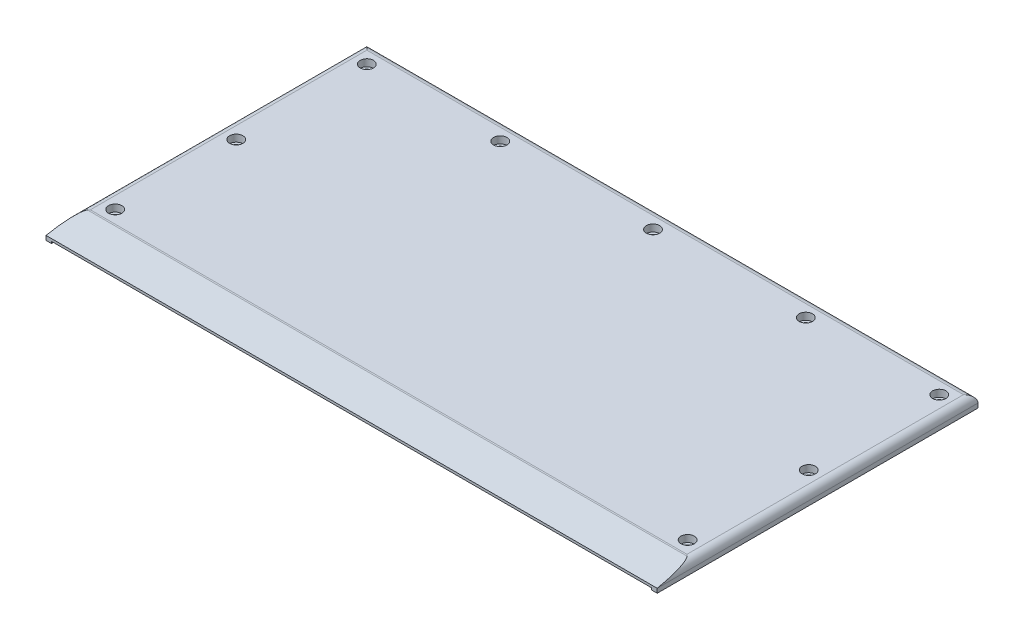
ISO-10303-21;
HEADER;
FILE_DESCRIPTION(('STEP AP214'),'2;1');
FILE_NAME('part.step','',(''),(''),'','','');
FILE_SCHEMA(('AUTOMOTIVE_DESIGN { 1 0 10303 214 1 1 1 1 }'));
ENDSEC;
DATA;
#1=APPLICATION_CONTEXT('core data for automotive mechanical design processes');
#2=APPLICATION_PROTOCOL_DEFINITION('international standard','automotive_design',2000,#1);
#3=PRODUCT_CONTEXT('',#1,'mechanical');
#4=PRODUCT('Part','Part','',(#3));
#5=PRODUCT_RELATED_PRODUCT_CATEGORY('part','',(#4));
#6=PRODUCT_DEFINITION_FORMATION('','',#4);
#7=PRODUCT_DEFINITION_CONTEXT('part definition',#1,'design');
#8=PRODUCT_DEFINITION('design','',#6,#7);
#9=PRODUCT_DEFINITION_SHAPE('','',#8);
#10=(LENGTH_UNIT() NAMED_UNIT(*) SI_UNIT(.MILLI.,.METRE.));
#11=(NAMED_UNIT(*) PLANE_ANGLE_UNIT() SI_UNIT($,.RADIAN.));
#12=(NAMED_UNIT(*) SI_UNIT($,.STERADIAN.) SOLID_ANGLE_UNIT());
#13=UNCERTAINTY_MEASURE_WITH_UNIT(LENGTH_MEASURE(1.E-05),#10,'distance_accuracy_value','');
#14=(GEOMETRIC_REPRESENTATION_CONTEXT(3) GLOBAL_UNCERTAINTY_ASSIGNED_CONTEXT((#13)) GLOBAL_UNIT_ASSIGNED_CONTEXT((#10,
#11,#12)) REPRESENTATION_CONTEXT('',''));
#15=CARTESIAN_POINT('',(0.,0.,0.));
#16=DIRECTION('',(0.,0.,1.));
#17=DIRECTION('',(1.,0.,0.));
#18=AXIS2_PLACEMENT_3D('',#15,#16,#17);
#19=CARTESIAN_POINT('',(8.,4.,61.92));
#20=DIRECTION('',(0.,-1.,0.));
#21=DIRECTION('',(0.,0.,-1.));
#22=AXIS2_PLACEMENT_3D('',#19,#20,#21);
#23=CYLINDRICAL_SURFACE('',#22,1.6);
#24=CARTESIAN_POINT('',(8.,0.,61.92));
#25=DIRECTION('',(0.,1.,0.));
#26=DIRECTION('',(0.,0.,1.));
#27=AXIS2_PLACEMENT_3D('',#24,#25,#26);
#28=CIRCLE('',#27,1.6);
#29=CARTESIAN_POINT('',(8.,0.,63.52));
#30=VERTEX_POINT('',#29);
#31=EDGE_CURVE('E387',#30,#30,#28,.T.);
#32=ORIENTED_EDGE('',*,*,#31,.F.);
#33=EDGE_LOOP('',(#32));
#34=FACE_BOUND('',#33,.T.);
#35=CARTESIAN_POINT('',(8.,1.1,61.92));
#36=DIRECTION('',(0.,1.,0.));
#37=DIRECTION('',(0.,0.,1.));
#38=AXIS2_PLACEMENT_3D('',#35,#36,#37);
#39=CIRCLE('',#38,1.6);
#40=CARTESIAN_POINT('',(8.,1.1,63.52));
#41=VERTEX_POINT('',#40);
#42=EDGE_CURVE('E239',#41,#41,#39,.T.);
#43=ORIENTED_EDGE('',*,*,#42,.T.);
#44=EDGE_LOOP('',(#43));
#45=FACE_BOUND('',#44,.T.);
#46=ADVANCED_FACE('F43',(#34,#45),#23,.F.);
#47=CARTESIAN_POINT('',(8.,4.,8.));
#48=DIRECTION('',(0.,-1.,0.));
#49=DIRECTION('',(0.,0.,-1.));
#50=AXIS2_PLACEMENT_3D('',#47,#48,#49);
#51=CYLINDRICAL_SURFACE('',#50,1.6);
#52=CARTESIAN_POINT('',(8.,0.,8.));
#53=DIRECTION('',(0.,1.,0.));
#54=DIRECTION('',(0.,0.,1.));
#55=AXIS2_PLACEMENT_3D('',#52,#53,#54);
#56=CIRCLE('',#55,1.6);
#57=CARTESIAN_POINT('',(8.,0.,9.6));
#58=VERTEX_POINT('',#57);
#59=EDGE_CURVE('E383',#58,#58,#56,.T.);
#60=ORIENTED_EDGE('',*,*,#59,.F.);
#61=EDGE_LOOP('',(#60));
#62=FACE_BOUND('',#61,.T.);
#63=CARTESIAN_POINT('',(8.,1.1,8.));
#64=DIRECTION('',(0.,1.,0.));
#65=DIRECTION('',(0.,0.,1.));
#66=AXIS2_PLACEMENT_3D('',#63,#64,#65);
#67=CIRCLE('',#66,1.6);
#68=CARTESIAN_POINT('',(8.,1.1,9.6));
#69=VERTEX_POINT('',#68);
#70=EDGE_CURVE('E235',#69,#69,#67,.T.);
#71=ORIENTED_EDGE('',*,*,#70,.T.);
#72=EDGE_LOOP('',(#71));
#73=FACE_BOUND('',#72,.T.);
#74=ADVANCED_FACE('F442',(#62,#73),#51,.F.);
#75=CARTESIAN_POINT('',(244.42,4.,8.));
#76=DIRECTION('',(0.,-1.,0.));
#77=DIRECTION('',(0.,0.,-1.));
#78=AXIS2_PLACEMENT_3D('',#75,#76,#77);
#79=CYLINDRICAL_SURFACE('',#78,1.59999999999999);
#80=CARTESIAN_POINT('',(244.42,0.,8.));
#81=DIRECTION('',(0.,1.,0.));
#82=DIRECTION('',(0.,0.,1.));
#83=AXIS2_PLACEMENT_3D('',#80,#81,#82);
#84=CIRCLE('',#83,1.59999999999999);
#85=CARTESIAN_POINT('',(244.42,0.,9.59999999999999));
#86=VERTEX_POINT('',#85);
#87=EDGE_CURVE('E379',#86,#86,#84,.T.);
#88=ORIENTED_EDGE('',*,*,#87,.F.);
#89=EDGE_LOOP('',(#88));
#90=FACE_BOUND('',#89,.T.);
#91=CARTESIAN_POINT('',(244.42,1.1,8.));
#92=DIRECTION('',(0.,1.,0.));
#93=DIRECTION('',(0.,0.,1.));
#94=AXIS2_PLACEMENT_3D('',#91,#92,#93);
#95=CIRCLE('',#94,1.59999999999999);
#96=CARTESIAN_POINT('',(244.42,1.1,9.59999999999999));
#97=VERTEX_POINT('',#96);
#98=EDGE_CURVE('E231',#97,#97,#95,.T.);
#99=ORIENTED_EDGE('',*,*,#98,.T.);
#100=EDGE_LOOP('',(#99));
#101=FACE_BOUND('',#100,.T.);
#102=ADVANCED_FACE('F448',(#90,#101),#79,.F.);
#103=CARTESIAN_POINT('',(244.42,4.,61.92));
#104=DIRECTION('',(0.,-1.,0.));
#105=DIRECTION('',(0.,0.,-1.));
#106=AXIS2_PLACEMENT_3D('',#103,#104,#105);
#107=CYLINDRICAL_SURFACE('',#106,1.59999999999999);
#108=CARTESIAN_POINT('',(244.42,0.,61.92));
#109=DIRECTION('',(0.,1.,0.));
#110=DIRECTION('',(0.,0.,1.));
#111=AXIS2_PLACEMENT_3D('',#108,#109,#110);
#112=CIRCLE('',#111,1.59999999999999);
#113=CARTESIAN_POINT('',(244.42,0.,63.52));
#114=VERTEX_POINT('',#113);
#115=EDGE_CURVE('E375',#114,#114,#112,.T.);
#116=ORIENTED_EDGE('',*,*,#115,.F.);
#117=EDGE_LOOP('',(#116));
#118=FACE_BOUND('',#117,.T.);
#119=CARTESIAN_POINT('',(244.42,1.1,61.92));
#120=DIRECTION('',(0.,1.,0.));
#121=DIRECTION('',(0.,0.,1.));
#122=AXIS2_PLACEMENT_3D('',#119,#120,#121);
#123=CIRCLE('',#122,1.59999999999999);
#124=CARTESIAN_POINT('',(244.42,1.1,63.52));
#125=VERTEX_POINT('',#124);
#126=EDGE_CURVE('E227',#125,#125,#123,.T.);
#127=ORIENTED_EDGE('',*,*,#126,.T.);
#128=EDGE_LOOP('',(#127));
#129=FACE_BOUND('',#128,.T.);
#130=ADVANCED_FACE('F457',(#118,#129),#107,.F.);
#131=CARTESIAN_POINT('',(244.42,4.,111.92));
#132=DIRECTION('',(0.,-1.,0.));
#133=DIRECTION('',(0.,0.,-1.));
#134=AXIS2_PLACEMENT_3D('',#131,#132,#133);
#135=CYLINDRICAL_SURFACE('',#134,1.59999999999999);
#136=CARTESIAN_POINT('',(244.42,0.,111.92));
#137=DIRECTION('',(0.,1.,0.));
#138=DIRECTION('',(0.,0.,1.));
#139=AXIS2_PLACEMENT_3D('',#136,#137,#138);
#140=CIRCLE('',#139,1.59999999999999);
#141=CARTESIAN_POINT('',(244.42,0.,113.52));
#142=VERTEX_POINT('',#141);
#143=EDGE_CURVE('E371',#142,#142,#140,.T.);
#144=ORIENTED_EDGE('',*,*,#143,.F.);
#145=EDGE_LOOP('',(#144));
#146=FACE_BOUND('',#145,.T.);
#147=CARTESIAN_POINT('',(244.42,1.1,111.92));
#148=DIRECTION('',(0.,1.,0.));
#149=DIRECTION('',(0.,0.,1.));
#150=AXIS2_PLACEMENT_3D('',#147,#148,#149);
#151=CIRCLE('',#150,1.59999999999999);
#152=CARTESIAN_POINT('',(244.42,1.1,113.52));
#153=VERTEX_POINT('',#152);
#154=EDGE_CURVE('E223',#153,#153,#151,.T.);
#155=ORIENTED_EDGE('',*,*,#154,.T.);
#156=EDGE_LOOP('',(#155));
#157=FACE_BOUND('',#156,.T.);
#158=ADVANCED_FACE('F461',(#146,#157),#135,.F.);
#159=CARTESIAN_POINT('',(63.11,4.,8.));
#160=DIRECTION('',(0.,-1.,0.));
#161=DIRECTION('',(0.,0.,-1.));
#162=AXIS2_PLACEMENT_3D('',#159,#160,#161);
#163=CYLINDRICAL_SURFACE('',#162,1.60000000000001);
#164=CARTESIAN_POINT('',(63.11,0.,8.));
#165=DIRECTION('',(0.,1.,0.));
#166=DIRECTION('',(0.,0.,1.));
#167=AXIS2_PLACEMENT_3D('',#164,#165,#166);
#168=CIRCLE('',#167,1.60000000000001);
#169=CARTESIAN_POINT('',(63.11,0.,9.60000000000001));
#170=VERTEX_POINT('',#169);
#171=EDGE_CURVE('E367',#170,#170,#168,.T.);
#172=ORIENTED_EDGE('',*,*,#171,.F.);
#173=EDGE_LOOP('',(#172));
#174=FACE_BOUND('',#173,.T.);
#175=CARTESIAN_POINT('',(63.11,1.1,8.));
#176=DIRECTION('',(0.,1.,0.));
#177=DIRECTION('',(0.,0.,1.));
#178=AXIS2_PLACEMENT_3D('',#175,#176,#177);
#179=CIRCLE('',#178,1.60000000000001);
#180=CARTESIAN_POINT('',(63.11,1.1,9.60000000000001));
#181=VERTEX_POINT('',#180);
#182=EDGE_CURVE('E219',#181,#181,#179,.T.);
#183=ORIENTED_EDGE('',*,*,#182,.T.);
#184=EDGE_LOOP('',(#183));
#185=FACE_BOUND('',#184,.T.);
#186=ADVANCED_FACE('F465',(#174,#185),#163,.F.);
#187=CARTESIAN_POINT('',(126.21,4.,8.));
#188=DIRECTION('',(0.,-1.,0.));
#189=DIRECTION('',(0.,0.,-1.));
#190=AXIS2_PLACEMENT_3D('',#187,#188,#189);
#191=CYLINDRICAL_SURFACE('',#190,1.59999999999999);
#192=CARTESIAN_POINT('',(126.21,0.,8.));
#193=DIRECTION('',(0.,1.,0.));
#194=DIRECTION('',(0.,0.,1.));
#195=AXIS2_PLACEMENT_3D('',#192,#193,#194);
#196=CIRCLE('',#195,1.59999999999999);
#197=CARTESIAN_POINT('',(126.21,0.,9.59999999999999));
#198=VERTEX_POINT('',#197);
#199=EDGE_CURVE('E363',#198,#198,#196,.T.);
#200=ORIENTED_EDGE('',*,*,#199,.F.);
#201=EDGE_LOOP('',(#200));
#202=FACE_BOUND('',#201,.T.);
#203=CARTESIAN_POINT('',(126.21,1.1,8.));
#204=DIRECTION('',(0.,1.,0.));
#205=DIRECTION('',(0.,0.,1.));
#206=AXIS2_PLACEMENT_3D('',#203,#204,#205);
#207=CIRCLE('',#206,1.59999999999999);
#208=CARTESIAN_POINT('',(126.21,1.1,9.59999999999999));
#209=VERTEX_POINT('',#208);
#210=EDGE_CURVE('E215',#209,#209,#207,.T.);
#211=ORIENTED_EDGE('',*,*,#210,.T.);
#212=EDGE_LOOP('',(#211));
#213=FACE_BOUND('',#212,.T.);
#214=ADVANCED_FACE('F469',(#202,#213),#191,.F.);
#215=CARTESIAN_POINT('',(189.31,4.,8.));
#216=DIRECTION('',(0.,-1.,0.));
#217=DIRECTION('',(0.,0.,-1.));
#218=AXIS2_PLACEMENT_3D('',#215,#216,#217);
#219=CYLINDRICAL_SURFACE('',#218,1.59999999999999);
#220=CARTESIAN_POINT('',(189.31,0.,8.));
#221=DIRECTION('',(0.,1.,0.));
#222=DIRECTION('',(0.,0.,1.));
#223=AXIS2_PLACEMENT_3D('',#220,#221,#222);
#224=CIRCLE('',#223,1.59999999999999);
#225=CARTESIAN_POINT('',(189.31,0.,9.59999999999999));
#226=VERTEX_POINT('',#225);
#227=EDGE_CURVE('E359',#226,#226,#224,.T.);
#228=ORIENTED_EDGE('',*,*,#227,.F.);
#229=EDGE_LOOP('',(#228));
#230=FACE_BOUND('',#229,.T.);
#231=CARTESIAN_POINT('',(189.31,1.1,8.));
#232=DIRECTION('',(0.,1.,0.));
#233=DIRECTION('',(0.,0.,1.));
#234=AXIS2_PLACEMENT_3D('',#231,#232,#233);
#235=CIRCLE('',#234,1.59999999999999);
#236=CARTESIAN_POINT('',(189.31,1.1,9.59999999999999));
#237=VERTEX_POINT('',#236);
#238=EDGE_CURVE('E210',#237,#237,#235,.T.);
#239=ORIENTED_EDGE('',*,*,#238,.T.);
#240=EDGE_LOOP('',(#239));
#241=FACE_BOUND('',#240,.T.);
#242=ADVANCED_FACE('F402',(#230,#241),#219,.F.);
#243=CARTESIAN_POINT('',(8.00000000000001,4.,111.92));
#244=DIRECTION('',(0.,-1.,0.));
#245=DIRECTION('',(0.,0.,-1.));
#246=AXIS2_PLACEMENT_3D('',#243,#244,#245);
#247=CYLINDRICAL_SURFACE('',#246,1.60000000000001);
#248=CARTESIAN_POINT('',(8.00000000000001,0.,111.92));
#249=DIRECTION('',(0.,1.,0.));
#250=DIRECTION('',(0.,0.,1.));
#251=AXIS2_PLACEMENT_3D('',#248,#249,#250);
#252=CIRCLE('',#251,1.60000000000001);
#253=CARTESIAN_POINT('',(8.00000000000001,0.,113.52));
#254=VERTEX_POINT('',#253);
#255=EDGE_CURVE('E391',#254,#254,#252,.T.);
#256=ORIENTED_EDGE('',*,*,#255,.F.);
#257=EDGE_LOOP('',(#256));
#258=FACE_BOUND('',#257,.T.);
#259=CARTESIAN_POINT('',(8.00000000000001,1.1,111.92));
#260=DIRECTION('',(0.,1.,0.));
#261=DIRECTION('',(0.,0.,1.));
#262=AXIS2_PLACEMENT_3D('',#259,#260,#261);
#263=CIRCLE('',#262,1.60000000000001);
#264=CARTESIAN_POINT('',(8.00000000000001,1.1,113.52));
#265=VERTEX_POINT('',#264);
#266=EDGE_CURVE('E206',#265,#265,#263,.T.);
#267=ORIENTED_EDGE('',*,*,#266,.T.);
#268=EDGE_LOOP('',(#267));
#269=FACE_BOUND('',#268,.T.);
#270=ADVANCED_FACE('F399',(#258,#269),#247,.F.);
#271=CARTESIAN_POINT('',(252.42,4.,0.));
#272=DIRECTION('',(1.,0.,0.));
#273=DIRECTION('',(0.,0.,-1.));
#274=AXIS2_PLACEMENT_3D('',#271,#272,#273);
#275=PLANE('',#274);
#276=DIRECTION('',(0.,-1.,0.));
#277=VECTOR('',#276,1.);
#278=CARTESIAN_POINT('',(252.42,4.,0.));
#279=LINE('',#278,#277);
#280=CARTESIAN_POINT('',(252.42,1.,0.));
#281=VERTEX_POINT('',#280);
#282=CARTESIAN_POINT('',(252.42,-0.8,0.));
#283=VERTEX_POINT('',#282);
#284=EDGE_CURVE('E194',#281,#283,#279,.T.);
#285=ORIENTED_EDGE('',*,*,#284,.F.);
#286=DIRECTION('',(0.,0.,1.));
#287=VECTOR('',#286,1.);
#288=CARTESIAN_POINT('',(252.42,1.,0.));
#289=LINE('',#288,#287);
#290=CARTESIAN_POINT('',(252.42,1.,132.49));
#291=VERTEX_POINT('',#290);
#292=EDGE_CURVE('E11',#281,#291,#289,.T.);
#293=ORIENTED_EDGE('',*,*,#292,.T.);
#294=DIRECTION('',(0.,-1.,0.));
#295=VECTOR('',#294,1.);
#296=CARTESIAN_POINT('',(252.42,4.,132.49));
#297=LINE('',#296,#295);
#298=CARTESIAN_POINT('',(252.42,-0.8,132.49));
#299=VERTEX_POINT('',#298);
#300=EDGE_CURVE('E147',#291,#299,#297,.T.);
#301=ORIENTED_EDGE('',*,*,#300,.T.);
#302=DIRECTION('',(0.,0.,1.));
#303=VECTOR('',#302,1.);
#304=CARTESIAN_POINT('',(252.42,-0.8,0.));
#305=LINE('',#304,#303);
#306=EDGE_CURVE('E195',#283,#299,#305,.T.);
#307=ORIENTED_EDGE('',*,*,#306,.F.);
#308=EDGE_LOOP('',(#285,#293,#301,#307));
#309=FACE_BOUND('',#308,.T.);
#310=ADVANCED_FACE('F191',(#309),#275,.T.);
#311=CARTESIAN_POINT('',(0.,4.,0.));
#312=DIRECTION('',(0.,0.,-1.));
#313=DIRECTION('',(-1.,0.,0.));
#314=AXIS2_PLACEMENT_3D('',#311,#312,#313);
#315=PLANE('',#314);
#316=DIRECTION('',(0.,-1.,0.));
#317=VECTOR('',#316,1.);
#318=CARTESIAN_POINT('',(0.,4.,0.));
#319=LINE('',#318,#317);
#320=CARTESIAN_POINT('',(0.,1.,0.));
#321=VERTEX_POINT('',#320);
#322=CARTESIAN_POINT('',(0.,-0.8,0.));
#323=VERTEX_POINT('',#322);
#324=EDGE_CURVE('E159',#321,#323,#319,.T.);
#325=ORIENTED_EDGE('',*,*,#324,.F.);
#326=DIRECTION('',(1.,0.,0.));
#327=VECTOR('',#326,1.);
#328=CARTESIAN_POINT('',(0.,1.,0.));
#329=LINE('',#328,#327);
#330=EDGE_CURVE('E53',#321,#281,#329,.T.);
#331=ORIENTED_EDGE('',*,*,#330,.T.);
#332=ORIENTED_EDGE('',*,*,#284,.T.);
#333=DIRECTION('',(1.,0.,0.));
#334=VECTOR('',#333,1.);
#335=CARTESIAN_POINT('',(0.,-0.8,0.));
#336=LINE('',#335,#334);
#337=EDGE_CURVE('E326',#323,#283,#336,.T.);
#338=ORIENTED_EDGE('',*,*,#337,.F.);
#339=EDGE_LOOP('',(#325,#331,#332,#338));
#340=FACE_BOUND('',#339,.T.);
#341=ADVANCED_FACE('F481',(#340),#315,.T.);
#342=CARTESIAN_POINT('',(0.,4.,0.));
#343=DIRECTION('',(1.,0.,0.));
#344=DIRECTION('',(0.,0.,-1.));
#345=AXIS2_PLACEMENT_3D('',#342,#343,#344);
#346=PLANE('',#345);
#347=DIRECTION('',(0.,-1.,0.));
#348=VECTOR('',#347,1.);
#349=CARTESIAN_POINT('',(0.,4.,132.49));
#350=LINE('',#349,#348);
#351=CARTESIAN_POINT('',(0.,1.,132.49));
#352=VERTEX_POINT('',#351);
#353=CARTESIAN_POINT('',(0.,-0.8,132.49));
#354=VERTEX_POINT('',#353);
#355=EDGE_CURVE('E144',#352,#354,#350,.T.);
#356=ORIENTED_EDGE('',*,*,#355,.F.);
#357=DIRECTION('',(0.,0.,1.));
#358=VECTOR('',#357,1.);
#359=CARTESIAN_POINT('',(0.,1.,0.));
#360=LINE('',#359,#358);
#361=EDGE_CURVE('E138',#352,#321,#360,.F.);
#362=ORIENTED_EDGE('',*,*,#361,.T.);
#363=ORIENTED_EDGE('',*,*,#324,.T.);
#364=DIRECTION('',(0.,0.,1.));
#365=VECTOR('',#364,1.);
#366=CARTESIAN_POINT('',(0.,-0.8,0.));
#367=LINE('',#366,#365);
#368=EDGE_CURVE('E157',#323,#354,#367,.T.);
#369=ORIENTED_EDGE('',*,*,#368,.T.);
#370=EDGE_LOOP('',(#356,#362,#363,#369));
#371=FACE_BOUND('',#370,.T.);
#372=ADVANCED_FACE('F155',(#371),#346,.F.);
#373=CARTESIAN_POINT('',(0.,4.,132.49));
#374=DIRECTION('',(0.,0.,-1.));
#375=DIRECTION('',(-1.,0.,0.));
#376=AXIS2_PLACEMENT_3D('',#373,#374,#375);
#377=PLANE('',#376);
#378=ORIENTED_EDGE('',*,*,#300,.F.);
#379=DIRECTION('',(-1.,0.,0.));
#380=VECTOR('',#379,1.);
#381=CARTESIAN_POINT('',(252.421,1.,132.49));
#382=LINE('',#381,#380);
#383=EDGE_CURVE('E132',#291,#352,#382,.T.);
#384=ORIENTED_EDGE('',*,*,#383,.T.);
#385=ORIENTED_EDGE('',*,*,#355,.T.);
#386=DIRECTION('',(1.,0.,0.));
#387=VECTOR('',#386,1.);
#388=CARTESIAN_POINT('',(0.,-0.8,132.49));
#389=LINE('',#388,#387);
#390=CARTESIAN_POINT('',(2.30000000000002,-0.8,132.49));
#391=VERTEX_POINT('',#390);
#392=EDGE_CURVE('E307',#354,#391,#389,.T.);
#393=ORIENTED_EDGE('',*,*,#392,.T.);
#394=DIRECTION('',(0.,1.,0.));
#395=VECTOR('',#394,1.);
#396=CARTESIAN_POINT('',(2.30000000000002,-0.8,132.49));
#397=LINE('',#396,#395);
#398=CARTESIAN_POINT('',(2.30000000000002,0.,132.49));
#399=VERTEX_POINT('',#398);
#400=EDGE_CURVE('E331',#391,#399,#397,.T.);
#401=ORIENTED_EDGE('',*,*,#400,.T.);
#402=DIRECTION('',(1.,0.,0.));
#403=VECTOR('',#402,1.);
#404=CARTESIAN_POINT('',(0.,0.,132.49));
#405=LINE('',#404,#403);
#406=CARTESIAN_POINT('',(250.12,0.,132.49));
#407=VERTEX_POINT('',#406);
#408=EDGE_CURVE('E344',#399,#407,#405,.T.);
#409=ORIENTED_EDGE('',*,*,#408,.T.);
#410=DIRECTION('',(0.,1.,0.));
#411=VECTOR('',#410,1.);
#412=CARTESIAN_POINT('',(250.12,-0.8,132.49));
#413=LINE('',#412,#411);
#414=CARTESIAN_POINT('',(250.12,-0.8,132.49));
#415=VERTEX_POINT('',#414);
#416=EDGE_CURVE('E340',#415,#407,#413,.T.);
#417=ORIENTED_EDGE('',*,*,#416,.F.);
#418=DIRECTION('',(1.,0.,0.));
#419=VECTOR('',#418,1.);
#420=CARTESIAN_POINT('',(0.,-0.8,132.49));
#421=LINE('',#420,#419);
#422=EDGE_CURVE('E321',#415,#299,#421,.T.);
#423=ORIENTED_EDGE('',*,*,#422,.T.);
#424=EDGE_LOOP('',(#378,#384,#385,#393,#401,#409,#417,#423));
#425=FACE_BOUND('',#424,.T.);
#426=ADVANCED_FACE('F142',(#425),#377,.F.);
#427=CARTESIAN_POINT('',(0.,4.,0.));
#428=DIRECTION('',(0.,1.,0.));
#429=DIRECTION('',(0.,0.,1.));
#430=AXIS2_PLACEMENT_3D('',#427,#428,#429);
#431=PLANE('',#430);
#432=DIRECTION('',(1.,0.,0.));
#433=VECTOR('',#432,1.);
#434=CARTESIAN_POINT('',(0.,4.,3.));
#435=LINE('',#434,#433);
#436=CARTESIAN_POINT('',(249.42,4.,3.));
#437=VERTEX_POINT('',#436);
#438=CARTESIAN_POINT('',(3.,4.,3.));
#439=VERTEX_POINT('',#438);
#440=EDGE_CURVE('E184',#437,#439,#435,.F.);
#441=ORIENTED_EDGE('',*,*,#440,.T.);
#442=DIRECTION('',(0.,0.,1.));
#443=VECTOR('',#442,1.);
#444=CARTESIAN_POINT('',(3.00000000000001,4.,117.49));
#445=LINE('',#444,#443);
#446=CARTESIAN_POINT('',(3.00000000000001,4.,117.192941459222));
#447=VERTEX_POINT('',#446);
#448=EDGE_CURVE('E248',#439,#447,#445,.T.);
#449=ORIENTED_EDGE('',*,*,#448,.T.);
#450=DIRECTION('',(-1.,0.,0.));
#451=VECTOR('',#450,1.);
#452=CARTESIAN_POINT('',(252.42,4.,117.192941459222));
#453=LINE('',#452,#451);
#454=CARTESIAN_POINT('',(249.42,4.,117.192941459222));
#455=VERTEX_POINT('',#454);
#456=EDGE_CURVE('E202',#447,#455,#453,.F.);
#457=ORIENTED_EDGE('',*,*,#456,.T.);
#458=DIRECTION('',(0.,0.,1.));
#459=VECTOR('',#458,1.);
#460=CARTESIAN_POINT('',(249.42,4.,0.));
#461=LINE('',#460,#459);
#462=EDGE_CURVE('E188',#455,#437,#461,.F.);
#463=ORIENTED_EDGE('',*,*,#462,.T.);
#464=EDGE_LOOP('',(#441,#449,#457,#463));
#465=FACE_BOUND('',#464,.T.);
#466=CARTESIAN_POINT('',(8.,4.,61.92));
#467=DIRECTION('',(0.,1.,0.));
#468=DIRECTION('',(0.,0.,1.));
#469=AXIS2_PLACEMENT_3D('',#466,#467,#468);
#470=CIRCLE('',#469,2.75);
#471=CARTESIAN_POINT('',(8.,4.,64.67));
#472=VERTEX_POINT('',#471);
#473=EDGE_CURVE('E150',#472,#472,#470,.T.);
#474=ORIENTED_EDGE('',*,*,#473,.F.);
#475=EDGE_LOOP('',(#474));
#476=FACE_BOUND('',#475,.T.);
#477=CARTESIAN_POINT('',(8.00000000000001,4.,111.92));
#478=DIRECTION('',(0.,1.,0.));
#479=DIRECTION('',(0.,0.,1.));
#480=AXIS2_PLACEMENT_3D('',#477,#478,#479);
#481=CIRCLE('',#480,2.75);
#482=CARTESIAN_POINT('',(8.00000000000001,4.,114.67));
#483=VERTEX_POINT('',#482);
#484=EDGE_CURVE('E267',#483,#483,#481,.T.);
#485=ORIENTED_EDGE('',*,*,#484,.F.);
#486=EDGE_LOOP('',(#485));
#487=FACE_BOUND('',#486,.T.);
#488=CARTESIAN_POINT('',(244.42,4.,111.92));
#489=DIRECTION('',(0.,1.,0.));
#490=DIRECTION('',(0.,0.,1.));
#491=AXIS2_PLACEMENT_3D('',#488,#489,#490);
#492=CIRCLE('',#491,2.75000000000001);
#493=CARTESIAN_POINT('',(244.42,4.,114.67));
#494=VERTEX_POINT('',#493);
#495=EDGE_CURVE('E271',#494,#494,#492,.T.);
#496=ORIENTED_EDGE('',*,*,#495,.F.);
#497=EDGE_LOOP('',(#496));
#498=FACE_BOUND('',#497,.T.);
#499=CARTESIAN_POINT('',(244.42,4.,61.92));
#500=DIRECTION('',(0.,1.,0.));
#501=DIRECTION('',(0.,0.,1.));
#502=AXIS2_PLACEMENT_3D('',#499,#500,#501);
#503=CIRCLE('',#502,2.75000000000001);
#504=CARTESIAN_POINT('',(244.42,4.,64.67));
#505=VERTEX_POINT('',#504);
#506=EDGE_CURVE('E275',#505,#505,#503,.T.);
#507=ORIENTED_EDGE('',*,*,#506,.F.);
#508=EDGE_LOOP('',(#507));
#509=FACE_BOUND('',#508,.T.);
#510=CARTESIAN_POINT('',(244.42,4.,8.));
#511=DIRECTION('',(0.,1.,0.));
#512=DIRECTION('',(0.,0.,1.));
#513=AXIS2_PLACEMENT_3D('',#510,#511,#512);
#514=CIRCLE('',#513,2.75000000000001);
#515=CARTESIAN_POINT('',(244.42,4.,10.75));
#516=VERTEX_POINT('',#515);
#517=EDGE_CURVE('E279',#516,#516,#514,.T.);
#518=ORIENTED_EDGE('',*,*,#517,.F.);
#519=EDGE_LOOP('',(#518));
#520=FACE_BOUND('',#519,.T.);
#521=CARTESIAN_POINT('',(189.31,4.,8.));
#522=DIRECTION('',(0.,1.,0.));
#523=DIRECTION('',(0.,0.,1.));
#524=AXIS2_PLACEMENT_3D('',#521,#522,#523);
#525=CIRCLE('',#524,2.75000000000001);
#526=CARTESIAN_POINT('',(189.31,4.,10.75));
#527=VERTEX_POINT('',#526);
#528=EDGE_CURVE('E283',#527,#527,#525,.T.);
#529=ORIENTED_EDGE('',*,*,#528,.F.);
#530=EDGE_LOOP('',(#529));
#531=FACE_BOUND('',#530,.T.);
#532=CARTESIAN_POINT('',(126.21,4.,8.));
#533=DIRECTION('',(0.,1.,0.));
#534=DIRECTION('',(0.,0.,1.));
#535=AXIS2_PLACEMENT_3D('',#532,#533,#534);
#536=CIRCLE('',#535,2.75000000000001);
#537=CARTESIAN_POINT('',(126.21,4.,10.75));
#538=VERTEX_POINT('',#537);
#539=EDGE_CURVE('E287',#538,#538,#536,.T.);
#540=ORIENTED_EDGE('',*,*,#539,.F.);
#541=EDGE_LOOP('',(#540));
#542=FACE_BOUND('',#541,.T.);
#543=CARTESIAN_POINT('',(63.11,4.,8.));
#544=DIRECTION('',(0.,1.,0.));
#545=DIRECTION('',(0.,0.,1.));
#546=AXIS2_PLACEMENT_3D('',#543,#544,#545);
#547=CIRCLE('',#546,2.75000000000001);
#548=CARTESIAN_POINT('',(63.11,4.,10.75));
#549=VERTEX_POINT('',#548);
#550=EDGE_CURVE('E291',#549,#549,#547,.T.);
#551=ORIENTED_EDGE('',*,*,#550,.F.);
#552=EDGE_LOOP('',(#551));
#553=FACE_BOUND('',#552,.T.);
#554=CARTESIAN_POINT('',(8.,4.,8.));
#555=DIRECTION('',(0.,1.,0.));
#556=DIRECTION('',(0.,0.,1.));
#557=AXIS2_PLACEMENT_3D('',#554,#555,#556);
#558=CIRCLE('',#557,2.75);
#559=CARTESIAN_POINT('',(8.,4.,10.75));
#560=VERTEX_POINT('',#559);
#561=EDGE_CURVE('E294',#560,#560,#558,.T.);
#562=ORIENTED_EDGE('',*,*,#561,.F.);
#563=EDGE_LOOP('',(#562));
#564=FACE_BOUND('',#563,.T.);
#565=ADVANCED_FACE('F256',(#465,#476,#487,#498,#509,#520,#531,#542,#553,#564),#431,.T.);
#566=CARTESIAN_POINT('',(0.,0.,0.));
#567=DIRECTION('',(0.,1.,0.));
#568=DIRECTION('',(0.,0.,1.));
#569=AXIS2_PLACEMENT_3D('',#566,#567,#568);
#570=PLANE('',#569);
#571=DIRECTION('',(-1.,0.,0.));
#572=VECTOR('',#571,1.);
#573=CARTESIAN_POINT('',(0.,0.,1.80000000000003));
#574=LINE('',#573,#572);
#575=CARTESIAN_POINT('',(250.12,0.,1.8));
#576=VERTEX_POINT('',#575);
#577=CARTESIAN_POINT('',(2.30000000000002,0.,1.80000000000001));
#578=VERTEX_POINT('',#577);
#579=EDGE_CURVE('E334',#576,#578,#574,.T.);
#580=ORIENTED_EDGE('',*,*,#579,.F.);
#581=DIRECTION('',(0.,0.,-1.));
#582=VECTOR('',#581,1.);
#583=CARTESIAN_POINT('',(250.12,0.,0.));
#584=LINE('',#583,#582);
#585=EDGE_CURVE('E311',#407,#576,#584,.T.);
#586=ORIENTED_EDGE('',*,*,#585,.F.);
#587=ORIENTED_EDGE('',*,*,#408,.F.);
#588=DIRECTION('',(0.,0.,-1.));
#589=VECTOR('',#588,1.);
#590=CARTESIAN_POINT('',(2.30000000000002,0.,0.));
#591=LINE('',#590,#589);
#592=EDGE_CURVE('E242',#399,#578,#591,.T.);
#593=ORIENTED_EDGE('',*,*,#592,.T.);
#594=EDGE_LOOP('',(#580,#586,#587,#593));
#595=FACE_BOUND('',#594,.T.);
#596=ORIENTED_EDGE('',*,*,#227,.T.);
#597=EDGE_LOOP('',(#596));
#598=FACE_BOUND('',#597,.T.);
#599=ORIENTED_EDGE('',*,*,#199,.T.);
#600=EDGE_LOOP('',(#599));
#601=FACE_BOUND('',#600,.T.);
#602=ORIENTED_EDGE('',*,*,#171,.T.);
#603=EDGE_LOOP('',(#602));
#604=FACE_BOUND('',#603,.T.);
#605=ORIENTED_EDGE('',*,*,#143,.T.);
#606=EDGE_LOOP('',(#605));
#607=FACE_BOUND('',#606,.T.);
#608=ORIENTED_EDGE('',*,*,#115,.T.);
#609=EDGE_LOOP('',(#608));
#610=FACE_BOUND('',#609,.T.);
#611=ORIENTED_EDGE('',*,*,#87,.T.);
#612=EDGE_LOOP('',(#611));
#613=FACE_BOUND('',#612,.T.);
#614=ORIENTED_EDGE('',*,*,#59,.T.);
#615=EDGE_LOOP('',(#614));
#616=FACE_BOUND('',#615,.T.);
#617=ORIENTED_EDGE('',*,*,#31,.T.);
#618=EDGE_LOOP('',(#617));
#619=FACE_BOUND('',#618,.T.);
#620=ORIENTED_EDGE('',*,*,#255,.T.);
#621=EDGE_LOOP('',(#620));
#622=FACE_BOUND('',#621,.T.);
#623=ADVANCED_FACE('F259',(#595,#598,#601,#604,#607,#610,#613,#616,#619,#622),#570,.F.);
#624=CARTESIAN_POINT('',(250.12,-0.8,0.));
#625=DIRECTION('',(1.,0.,0.));
#626=DIRECTION('',(0.,0.,-1.));
#627=AXIS2_PLACEMENT_3D('',#624,#625,#626);
#628=PLANE('',#627);
#629=ORIENTED_EDGE('',*,*,#585,.T.);
#630=DIRECTION('',(0.,1.,0.));
#631=VECTOR('',#630,1.);
#632=CARTESIAN_POINT('',(250.12,-0.8,1.8));
#633=LINE('',#632,#631);
#634=CARTESIAN_POINT('',(250.12,-0.8,1.8));
#635=VERTEX_POINT('',#634);
#636=EDGE_CURVE('E345',#635,#576,#633,.T.);
#637=ORIENTED_EDGE('',*,*,#636,.F.);
#638=DIRECTION('',(0.,0.,-1.));
#639=VECTOR('',#638,1.);
#640=CARTESIAN_POINT('',(250.12,-0.8,0.));
#641=LINE('',#640,#639);
#642=EDGE_CURVE('E318',#415,#635,#641,.T.);
#643=ORIENTED_EDGE('',*,*,#642,.F.);
#644=ORIENTED_EDGE('',*,*,#416,.T.);
#645=EDGE_LOOP('',(#629,#637,#643,#644));
#646=FACE_BOUND('',#645,.T.);
#647=ADVANCED_FACE('F640',(#646),#628,.F.);
#648=CARTESIAN_POINT('',(0.,-0.8,1.80000000000003));
#649=DIRECTION('',(0.,0.,-1.));
#650=DIRECTION('',(-1.,0.,0.));
#651=AXIS2_PLACEMENT_3D('',#648,#649,#650);
#652=PLANE('',#651);
#653=ORIENTED_EDGE('',*,*,#579,.T.);
#654=DIRECTION('',(0.,1.,0.));
#655=VECTOR('',#654,1.);
#656=CARTESIAN_POINT('',(2.30000000000002,-0.8,1.80000000000001));
#657=LINE('',#656,#655);
#658=CARTESIAN_POINT('',(2.30000000000002,-0.8,1.80000000000001));
#659=VERTEX_POINT('',#658);
#660=EDGE_CURVE('E349',#659,#578,#657,.T.);
#661=ORIENTED_EDGE('',*,*,#660,.F.);
#662=DIRECTION('',(-1.,0.,0.));
#663=VECTOR('',#662,1.);
#664=CARTESIAN_POINT('',(0.,-0.8,1.80000000000003));
#665=LINE('',#664,#663);
#666=EDGE_CURVE('E315',#635,#659,#665,.T.);
#667=ORIENTED_EDGE('',*,*,#666,.F.);
#668=ORIENTED_EDGE('',*,*,#636,.T.);
#669=EDGE_LOOP('',(#653,#661,#667,#668));
#670=FACE_BOUND('',#669,.T.);
#671=ADVANCED_FACE('F651',(#670),#652,.F.);
#672=CARTESIAN_POINT('',(2.30000000000002,-0.8,0.));
#673=DIRECTION('',(1.,0.,0.));
#674=DIRECTION('',(0.,0.,-1.));
#675=AXIS2_PLACEMENT_3D('',#672,#673,#674);
#676=PLANE('',#675);
#677=ORIENTED_EDGE('',*,*,#592,.F.);
#678=ORIENTED_EDGE('',*,*,#400,.F.);
#679=DIRECTION('',(0.,0.,-1.));
#680=VECTOR('',#679,1.);
#681=CARTESIAN_POINT('',(2.30000000000002,-0.8,0.));
#682=LINE('',#681,#680);
#683=EDGE_CURVE('E310',#391,#659,#682,.T.);
#684=ORIENTED_EDGE('',*,*,#683,.T.);
#685=ORIENTED_EDGE('',*,*,#660,.T.);
#686=EDGE_LOOP('',(#677,#678,#684,#685));
#687=FACE_BOUND('',#686,.T.);
#688=ADVANCED_FACE('F660',(#687),#676,.T.);
#689=CARTESIAN_POINT('',(0.,-0.8,0.));
#690=DIRECTION('',(0.,1.,0.));
#691=DIRECTION('',(0.,0.,1.));
#692=AXIS2_PLACEMENT_3D('',#689,#690,#691);
#693=PLANE('',#692);
#694=ORIENTED_EDGE('',*,*,#392,.F.);
#695=ORIENTED_EDGE('',*,*,#368,.F.);
#696=ORIENTED_EDGE('',*,*,#337,.T.);
#697=ORIENTED_EDGE('',*,*,#306,.T.);
#698=ORIENTED_EDGE('',*,*,#422,.F.);
#699=ORIENTED_EDGE('',*,*,#642,.T.);
#700=ORIENTED_EDGE('',*,*,#666,.T.);
#701=ORIENTED_EDGE('',*,*,#683,.F.);
#702=EDGE_LOOP('',(#694,#695,#696,#697,#698,#699,#700,#701));
#703=FACE_BOUND('',#702,.T.);
#704=ADVANCED_FACE('F667',(#703),#693,.F.);
#705=CARTESIAN_POINT('',(8.,1.1,8.));
#706=DIRECTION('',(0.,1.,0.));
#707=DIRECTION('',(0.,0.,1.));
#708=AXIS2_PLACEMENT_3D('',#705,#706,#707);
#709=CYLINDRICAL_SURFACE('',#708,2.75);
#710=CARTESIAN_POINT('',(8.,1.1,8.));
#711=DIRECTION('',(0.,1.,0.));
#712=DIRECTION('',(0.,0.,1.));
#713=AXIS2_PLACEMENT_3D('',#710,#711,#712);
#714=CIRCLE('',#713,2.75);
#715=CARTESIAN_POINT('',(8.,1.1,10.75));
#716=VERTEX_POINT('',#715);
#717=EDGE_CURVE('E211',#716,#716,#714,.T.);
#718=ORIENTED_EDGE('',*,*,#717,.F.);
#719=EDGE_LOOP('',(#718));
#720=FACE_BOUND('',#719,.T.);
#721=ORIENTED_EDGE('',*,*,#561,.T.);
#722=EDGE_LOOP('',(#721));
#723=FACE_BOUND('',#722,.T.);
#724=ADVANCED_FACE('F674',(#720,#723),#709,.F.);
#725=CARTESIAN_POINT('',(8.,1.1,8.));
#726=DIRECTION('',(0.,1.,0.));
#727=DIRECTION('',(0.,0.,1.));
#728=AXIS2_PLACEMENT_3D('',#725,#726,#727);
#729=PLANE('',#728);
#730=ORIENTED_EDGE('',*,*,#70,.F.);
#731=EDGE_LOOP('',(#730));
#732=FACE_BOUND('',#731,.T.);
#733=ORIENTED_EDGE('',*,*,#717,.T.);
#734=EDGE_LOOP('',(#733));
#735=FACE_BOUND('',#734,.T.);
#736=ADVANCED_FACE('F508',(#732,#735),#729,.T.);
#737=CARTESIAN_POINT('',(63.11,1.1,8.));
#738=DIRECTION('',(0.,1.,0.));
#739=DIRECTION('',(0.,0.,1.));
#740=AXIS2_PLACEMENT_3D('',#737,#738,#739);
#741=CYLINDRICAL_SURFACE('',#740,2.75000000000001);
#742=CARTESIAN_POINT('',(63.11,1.1,8.));
#743=DIRECTION('',(0.,1.,0.));
#744=DIRECTION('',(0.,0.,1.));
#745=AXIS2_PLACEMENT_3D('',#742,#743,#744);
#746=CIRCLE('',#745,2.75000000000001);
#747=CARTESIAN_POINT('',(63.11,1.1,10.75));
#748=VERTEX_POINT('',#747);
#749=EDGE_CURVE('E297',#748,#748,#746,.T.);
#750=ORIENTED_EDGE('',*,*,#749,.F.);
#751=EDGE_LOOP('',(#750));
#752=FACE_BOUND('',#751,.T.);
#753=ORIENTED_EDGE('',*,*,#550,.T.);
#754=EDGE_LOOP('',(#753));
#755=FACE_BOUND('',#754,.T.);
#756=ADVANCED_FACE('F504',(#752,#755),#741,.F.);
#757=CARTESIAN_POINT('',(63.11,1.1,8.));
#758=DIRECTION('',(0.,1.,0.));
#759=DIRECTION('',(0.,0.,1.));
#760=AXIS2_PLACEMENT_3D('',#757,#758,#759);
#761=PLANE('',#760);
#762=ORIENTED_EDGE('',*,*,#182,.F.);
#763=EDGE_LOOP('',(#762));
#764=FACE_BOUND('',#763,.T.);
#765=ORIENTED_EDGE('',*,*,#749,.T.);
#766=EDGE_LOOP('',(#765));
#767=FACE_BOUND('',#766,.T.);
#768=ADVANCED_FACE('F500',(#764,#767),#761,.T.);
#769=CARTESIAN_POINT('',(126.21,1.1,8.));
#770=DIRECTION('',(0.,1.,0.));
#771=DIRECTION('',(0.,0.,1.));
#772=AXIS2_PLACEMENT_3D('',#769,#770,#771);
#773=CYLINDRICAL_SURFACE('',#772,2.75000000000001);
#774=CARTESIAN_POINT('',(126.21,1.1,8.));
#775=DIRECTION('',(0.,1.,0.));
#776=DIRECTION('',(0.,0.,1.));
#777=AXIS2_PLACEMENT_3D('',#774,#775,#776);
#778=CIRCLE('',#777,2.75000000000001);
#779=CARTESIAN_POINT('',(126.21,1.1,10.75));
#780=VERTEX_POINT('',#779);
#781=EDGE_CURVE('E904',#780,#780,#778,.T.);
#782=ORIENTED_EDGE('',*,*,#781,.F.);
#783=EDGE_LOOP('',(#782));
#784=FACE_BOUND('',#783,.T.);
#785=ORIENTED_EDGE('',*,*,#539,.T.);
#786=EDGE_LOOP('',(#785));
#787=FACE_BOUND('',#786,.T.);
#788=ADVANCED_FACE('F503',(#784,#787),#773,.F.);
#789=CARTESIAN_POINT('',(126.21,1.1,8.));
#790=DIRECTION('',(0.,1.,0.));
#791=DIRECTION('',(0.,0.,1.));
#792=AXIS2_PLACEMENT_3D('',#789,#790,#791);
#793=PLANE('',#792);
#794=ORIENTED_EDGE('',*,*,#210,.F.);
#795=EDGE_LOOP('',(#794));
#796=FACE_BOUND('',#795,.T.);
#797=ORIENTED_EDGE('',*,*,#781,.T.);
#798=EDGE_LOOP('',(#797));
#799=FACE_BOUND('',#798,.T.);
#800=ADVANCED_FACE('F510',(#796,#799),#793,.T.);
#801=CARTESIAN_POINT('',(189.31,1.1,8.));
#802=DIRECTION('',(0.,1.,0.));
#803=DIRECTION('',(0.,0.,1.));
#804=AXIS2_PLACEMENT_3D('',#801,#802,#803);
#805=CYLINDRICAL_SURFACE('',#804,2.75000000000001);
#806=CARTESIAN_POINT('',(189.31,1.1,8.));
#807=DIRECTION('',(0.,1.,0.));
#808=DIRECTION('',(0.,0.,1.));
#809=AXIS2_PLACEMENT_3D('',#806,#807,#808);
#810=CIRCLE('',#809,2.75000000000001);
#811=CARTESIAN_POINT('',(189.31,1.1,10.75));
#812=VERTEX_POINT('',#811);
#813=EDGE_CURVE('E881',#812,#812,#810,.T.);
#814=ORIENTED_EDGE('',*,*,#813,.F.);
#815=EDGE_LOOP('',(#814));
#816=FACE_BOUND('',#815,.T.);
#817=ORIENTED_EDGE('',*,*,#528,.T.);
#818=EDGE_LOOP('',(#817));
#819=FACE_BOUND('',#818,.T.);
#820=ADVANCED_FACE('F513',(#816,#819),#805,.F.);
#821=CARTESIAN_POINT('',(189.31,1.1,8.));
#822=DIRECTION('',(0.,1.,0.));
#823=DIRECTION('',(0.,0.,1.));
#824=AXIS2_PLACEMENT_3D('',#821,#822,#823);
#825=PLANE('',#824);
#826=ORIENTED_EDGE('',*,*,#238,.F.);
#827=EDGE_LOOP('',(#826));
#828=FACE_BOUND('',#827,.T.);
#829=ORIENTED_EDGE('',*,*,#813,.T.);
#830=EDGE_LOOP('',(#829));
#831=FACE_BOUND('',#830,.T.);
#832=ADVANCED_FACE('F518',(#828,#831),#825,.T.);
#833=CARTESIAN_POINT('',(244.42,1.1,8.));
#834=DIRECTION('',(0.,1.,0.));
#835=DIRECTION('',(0.,0.,1.));
#836=AXIS2_PLACEMENT_3D('',#833,#834,#835);
#837=CYLINDRICAL_SURFACE('',#836,2.75000000000001);
#838=CARTESIAN_POINT('',(244.42,1.1,8.));
#839=DIRECTION('',(0.,1.,0.));
#840=DIRECTION('',(0.,0.,1.));
#841=AXIS2_PLACEMENT_3D('',#838,#839,#840);
#842=CIRCLE('',#841,2.75000000000001);
#843=CARTESIAN_POINT('',(244.42,1.1,10.75));
#844=VERTEX_POINT('',#843);
#845=EDGE_CURVE('E876',#844,#844,#842,.T.);
#846=ORIENTED_EDGE('',*,*,#845,.F.);
#847=EDGE_LOOP('',(#846));
#848=FACE_BOUND('',#847,.T.);
#849=ORIENTED_EDGE('',*,*,#517,.T.);
#850=EDGE_LOOP('',(#849));
#851=FACE_BOUND('',#850,.T.);
#852=ADVANCED_FACE('F521',(#848,#851),#837,.F.);
#853=CARTESIAN_POINT('',(244.42,1.1,8.));
#854=DIRECTION('',(0.,1.,0.));
#855=DIRECTION('',(0.,0.,1.));
#856=AXIS2_PLACEMENT_3D('',#853,#854,#855);
#857=PLANE('',#856);
#858=ORIENTED_EDGE('',*,*,#98,.F.);
#859=EDGE_LOOP('',(#858));
#860=FACE_BOUND('',#859,.T.);
#861=ORIENTED_EDGE('',*,*,#845,.T.);
#862=EDGE_LOOP('',(#861));
#863=FACE_BOUND('',#862,.T.);
#864=ADVANCED_FACE('F526',(#860,#863),#857,.T.);
#865=CARTESIAN_POINT('',(244.42,1.1,61.92));
#866=DIRECTION('',(0.,1.,0.));
#867=DIRECTION('',(0.,0.,1.));
#868=AXIS2_PLACEMENT_3D('',#865,#866,#867);
#869=CYLINDRICAL_SURFACE('',#868,2.75000000000001);
#870=CARTESIAN_POINT('',(244.42,1.1,61.92));
#871=DIRECTION('',(0.,1.,0.));
#872=DIRECTION('',(0.,0.,1.));
#873=AXIS2_PLACEMENT_3D('',#870,#871,#872);
#874=CIRCLE('',#873,2.75000000000001);
#875=CARTESIAN_POINT('',(244.42,1.1,64.67));
#876=VERTEX_POINT('',#875);
#877=EDGE_CURVE('E883',#876,#876,#874,.T.);
#878=ORIENTED_EDGE('',*,*,#877,.F.);
#879=EDGE_LOOP('',(#878));
#880=FACE_BOUND('',#879,.T.);
#881=ORIENTED_EDGE('',*,*,#506,.T.);
#882=EDGE_LOOP('',(#881));
#883=FACE_BOUND('',#882,.T.);
#884=ADVANCED_FACE('F529',(#880,#883),#869,.F.);
#885=CARTESIAN_POINT('',(244.42,1.1,61.92));
#886=DIRECTION('',(0.,1.,0.));
#887=DIRECTION('',(0.,0.,1.));
#888=AXIS2_PLACEMENT_3D('',#885,#886,#887);
#889=PLANE('',#888);
#890=ORIENTED_EDGE('',*,*,#126,.F.);
#891=EDGE_LOOP('',(#890));
#892=FACE_BOUND('',#891,.T.);
#893=ORIENTED_EDGE('',*,*,#877,.T.);
#894=EDGE_LOOP('',(#893));
#895=FACE_BOUND('',#894,.T.);
#896=ADVANCED_FACE('F534',(#892,#895),#889,.T.);
#897=CARTESIAN_POINT('',(244.42,1.1,111.92));
#898=DIRECTION('',(0.,1.,0.));
#899=DIRECTION('',(0.,0.,1.));
#900=AXIS2_PLACEMENT_3D('',#897,#898,#899);
#901=CYLINDRICAL_SURFACE('',#900,2.75000000000001);
#902=CARTESIAN_POINT('',(244.42,1.1,111.92));
#903=DIRECTION('',(0.,1.,0.));
#904=DIRECTION('',(0.,0.,1.));
#905=AXIS2_PLACEMENT_3D('',#902,#903,#904);
#906=CIRCLE('',#905,2.75000000000001);
#907=CARTESIAN_POINT('',(244.42,1.1,114.67));
#908=VERTEX_POINT('',#907);
#909=EDGE_CURVE('E420',#908,#908,#906,.T.);
#910=ORIENTED_EDGE('',*,*,#909,.F.);
#911=EDGE_LOOP('',(#910));
#912=FACE_BOUND('',#911,.T.);
#913=ORIENTED_EDGE('',*,*,#495,.T.);
#914=EDGE_LOOP('',(#913));
#915=FACE_BOUND('',#914,.T.);
#916=ADVANCED_FACE('F537',(#912,#915),#901,.F.);
#917=CARTESIAN_POINT('',(244.42,1.1,111.92));
#918=DIRECTION('',(0.,1.,0.));
#919=DIRECTION('',(0.,0.,1.));
#920=AXIS2_PLACEMENT_3D('',#917,#918,#919);
#921=PLANE('',#920);
#922=ORIENTED_EDGE('',*,*,#154,.F.);
#923=EDGE_LOOP('',(#922));
#924=FACE_BOUND('',#923,.T.);
#925=ORIENTED_EDGE('',*,*,#909,.T.);
#926=EDGE_LOOP('',(#925));
#927=FACE_BOUND('',#926,.T.);
#928=ADVANCED_FACE('F542',(#924,#927),#921,.T.);
#929=CARTESIAN_POINT('',(8.00000000000001,1.1,111.92));
#930=DIRECTION('',(0.,1.,0.));
#931=DIRECTION('',(0.,0.,1.));
#932=AXIS2_PLACEMENT_3D('',#929,#930,#931);
#933=CYLINDRICAL_SURFACE('',#932,2.75);
#934=CARTESIAN_POINT('',(8.00000000000001,1.1,111.92));
#935=DIRECTION('',(0.,1.,0.));
#936=DIRECTION('',(0.,0.,1.));
#937=AXIS2_PLACEMENT_3D('',#934,#935,#936);
#938=CIRCLE('',#937,2.75);
#939=CARTESIAN_POINT('',(8.00000000000001,1.1,114.67));
#940=VERTEX_POINT('',#939);
#941=EDGE_CURVE('E414',#940,#940,#938,.T.);
#942=ORIENTED_EDGE('',*,*,#941,.F.);
#943=EDGE_LOOP('',(#942));
#944=FACE_BOUND('',#943,.T.);
#945=ORIENTED_EDGE('',*,*,#484,.T.);
#946=EDGE_LOOP('',(#945));
#947=FACE_BOUND('',#946,.T.);
#948=ADVANCED_FACE('F410',(#944,#947),#933,.F.);
#949=CARTESIAN_POINT('',(8.00000000000001,1.1,111.92));
#950=DIRECTION('',(0.,1.,0.));
#951=DIRECTION('',(0.,0.,1.));
#952=AXIS2_PLACEMENT_3D('',#949,#950,#951);
#953=PLANE('',#952);
#954=ORIENTED_EDGE('',*,*,#266,.F.);
#955=EDGE_LOOP('',(#954));
#956=FACE_BOUND('',#955,.T.);
#957=ORIENTED_EDGE('',*,*,#941,.T.);
#958=EDGE_LOOP('',(#957));
#959=FACE_BOUND('',#958,.T.);
#960=ADVANCED_FACE('F406',(#956,#959),#953,.T.);
#961=CARTESIAN_POINT('',(8.,1.1,61.92));
#962=DIRECTION('',(0.,1.,0.));
#963=DIRECTION('',(0.,0.,1.));
#964=AXIS2_PLACEMENT_3D('',#961,#962,#963);
#965=CYLINDRICAL_SURFACE('',#964,2.75);
#966=CARTESIAN_POINT('',(8.,1.1,61.92));
#967=DIRECTION('',(0.,1.,0.));
#968=DIRECTION('',(0.,0.,1.));
#969=AXIS2_PLACEMENT_3D('',#966,#967,#968);
#970=CIRCLE('',#969,2.75);
#971=CARTESIAN_POINT('',(8.,1.1,64.67));
#972=VERTEX_POINT('',#971);
#973=EDGE_CURVE('E422',#972,#972,#970,.T.);
#974=ORIENTED_EDGE('',*,*,#973,.F.);
#975=EDGE_LOOP('',(#974));
#976=FACE_BOUND('',#975,.T.);
#977=ORIENTED_EDGE('',*,*,#473,.T.);
#978=EDGE_LOOP('',(#977));
#979=FACE_BOUND('',#978,.T.);
#980=ADVANCED_FACE('F409',(#976,#979),#965,.F.);
#981=CARTESIAN_POINT('',(8.,1.1,61.92));
#982=DIRECTION('',(0.,1.,0.));
#983=DIRECTION('',(0.,0.,1.));
#984=AXIS2_PLACEMENT_3D('',#981,#982,#983);
#985=PLANE('',#984);
#986=ORIENTED_EDGE('',*,*,#42,.F.);
#987=EDGE_LOOP('',(#986));
#988=FACE_BOUND('',#987,.T.);
#989=ORIENTED_EDGE('',*,*,#973,.T.);
#990=EDGE_LOOP('',(#989));
#991=FACE_BOUND('',#990,.T.);
#992=ADVANCED_FACE('F431',(#988,#991),#985,.T.);
#993=CARTESIAN_POINT('',(252.421,4.,117.49));
#994=DIRECTION('',(0.,-0.98058067569092,-0.196116135138184));
#995=DIRECTION('',(0.,0.196116135138184,-0.98058067569092));
#996=AXIS2_PLACEMENT_3D('',#993,#994,#995);
#997=PLANE('',#996);
#998=DIRECTION('',(-1.,0.,0.));
#999=VECTOR('',#998,1.);
#1000=CARTESIAN_POINT('',(0.,3.94174202707276,117.781289864636));
#1001=LINE('',#1000,#999);
#1002=CARTESIAN_POINT('',(250.008348405415,3.94174202707276,117.781289864636));
#1003=VERTEX_POINT('',#1002);
#1004=CARTESIAN_POINT('',(2.41165159458546,3.94174202707276,117.781289864636));
#1005=VERTEX_POINT('',#1004);
#1006=EDGE_CURVE('E135',#1003,#1005,#1001,.T.);
#1007=ORIENTED_EDGE('',*,*,#1006,.T.);
#1008=CARTESIAN_POINT('',(3.00000000000002,1.,132.49));
#1009=DIRECTION('',(0.,-0.98058067569092,-0.196116135138184));
#1010=DIRECTION('',(0.,0.196116135138184,-0.98058067569092));
#1011=AXIS2_PLACEMENT_3D('',#1008,#1009,#1010);
#1012=ELLIPSE('',#1011,15.2970585407784,3.);
#1013=EDGE_CURVE('E129',#1005,#352,#1012,.F.);
#1014=ORIENTED_EDGE('',*,*,#1013,.T.);
#1015=ORIENTED_EDGE('',*,*,#383,.F.);
#1016=CARTESIAN_POINT('',(249.42,1.,132.49));
#1017=DIRECTION('',(0.,-0.98058067569092,-0.196116135138184));
#1018=DIRECTION('',(0.,-0.196116135138184,0.98058067569092));
#1019=AXIS2_PLACEMENT_3D('',#1016,#1017,#1018);
#1020=ELLIPSE('',#1019,15.2970585407784,3.);
#1021=EDGE_CURVE('E189',#291,#1003,#1020,.F.);
#1022=ORIENTED_EDGE('',*,*,#1021,.T.);
#1023=EDGE_LOOP('',(#1007,#1014,#1015,#1022));
#1024=FACE_BOUND('',#1023,.T.);
#1025=ADVANCED_FACE('F131',(#1024),#997,.F.);
#1026=CARTESIAN_POINT('',(249.42,1.,0.));
#1027=DIRECTION('',(0.,0.,1.));
#1028=DIRECTION('',(1.,0.,0.));
#1029=AXIS2_PLACEMENT_3D('',#1026,#1027,#1028);
#1030=CYLINDRICAL_SURFACE('',#1029,3.);
#1031=ORIENTED_EDGE('',*,*,#1021,.F.);
#1032=ORIENTED_EDGE('',*,*,#292,.F.);
#1033=CARTESIAN_POINT('',(249.42,1.,3.));
#1034=DIRECTION('',(0.707106781186547,0.,0.707106781186547));
#1035=DIRECTION('',(-0.707106781186547,0.,0.707106781186547));
#1036=AXIS2_PLACEMENT_3D('',#1033,#1034,#1035);
#1037=ELLIPSE('',#1036,4.24264068711928,3.);
#1038=EDGE_CURVE('E47',#437,#281,#1037,.F.);
#1039=ORIENTED_EDGE('',*,*,#1038,.F.);
#1040=ORIENTED_EDGE('',*,*,#462,.F.);
#1041=CARTESIAN_POINT('',(249.42,1.,117.192941459222));
#1042=DIRECTION('',(-0.707106781186547,0.,0.707106781186548));
#1043=DIRECTION('',(0.707106781186548,0.,0.707106781186547));
#1044=AXIS2_PLACEMENT_3D('',#1041,#1042,#1043);
#1045=ELLIPSE('',#1044,4.24264068711928,3.);
#1046=EDGE_CURVE('E172',#1003,#455,#1045,.T.);
#1047=ORIENTED_EDGE('',*,*,#1046,.F.);
#1048=EDGE_LOOP('',(#1031,#1032,#1039,#1040,#1047));
#1049=FACE_BOUND('',#1048,.T.);
#1050=ADVANCED_FACE('F45',(#1049),#1030,.T.);
#1051=CARTESIAN_POINT('',(0.,1.,3.));
#1052=DIRECTION('',(1.,0.,0.));
#1053=DIRECTION('',(0.,0.,-1.));
#1054=AXIS2_PLACEMENT_3D('',#1051,#1052,#1053);
#1055=CYLINDRICAL_SURFACE('',#1054,3.);
#1056=ORIENTED_EDGE('',*,*,#1038,.T.);
#1057=ORIENTED_EDGE('',*,*,#330,.F.);
#1058=CARTESIAN_POINT('',(3.,1.,3.));
#1059=DIRECTION('',(0.707106781186547,0.,-0.707106781186548));
#1060=DIRECTION('',(0.707106781186548,0.,0.707106781186547));
#1061=AXIS2_PLACEMENT_3D('',#1058,#1059,#1060);
#1062=ELLIPSE('',#1061,4.24264068711929,3.);
#1063=EDGE_CURVE('E68',#439,#321,#1062,.F.);
#1064=ORIENTED_EDGE('',*,*,#1063,.F.);
#1065=ORIENTED_EDGE('',*,*,#440,.F.);
#1066=EDGE_LOOP('',(#1056,#1057,#1064,#1065));
#1067=FACE_BOUND('',#1066,.T.);
#1068=ADVANCED_FACE('F183',(#1067),#1055,.T.);
#1069=CARTESIAN_POINT('',(252.421,1.,117.192941459222));
#1070=DIRECTION('',(1.,0.,0.));
#1071=DIRECTION('',(0.,0.,-1.));
#1072=AXIS2_PLACEMENT_3D('',#1069,#1070,#1071);
#1073=CYLINDRICAL_SURFACE('',#1072,3.);
#1074=ORIENTED_EDGE('',*,*,#1046,.T.);
#1075=ORIENTED_EDGE('',*,*,#456,.F.);
#1076=CARTESIAN_POINT('',(3.00000000000002,1.,117.192941459222));
#1077=DIRECTION('',(0.707106781186548,0.,0.707106781186547));
#1078=DIRECTION('',(0.707106781186547,0.,-0.707106781186548));
#1079=AXIS2_PLACEMENT_3D('',#1076,#1077,#1078);
#1080=ELLIPSE('',#1079,4.24264068711928,3.);
#1081=EDGE_CURVE('E168',#1005,#447,#1080,.F.);
#1082=ORIENTED_EDGE('',*,*,#1081,.F.);
#1083=ORIENTED_EDGE('',*,*,#1006,.F.);
#1084=EDGE_LOOP('',(#1074,#1075,#1082,#1083));
#1085=FACE_BOUND('',#1084,.T.);
#1086=ADVANCED_FACE('F254',(#1085),#1073,.T.);
#1087=CARTESIAN_POINT('',(3.,1.,0.));
#1088=DIRECTION('',(0.,0.,-1.));
#1089=DIRECTION('',(-1.,0.,0.));
#1090=AXIS2_PLACEMENT_3D('',#1087,#1088,#1089);
#1091=CYLINDRICAL_SURFACE('',#1090,3.);
#1092=ORIENTED_EDGE('',*,*,#1063,.T.);
#1093=ORIENTED_EDGE('',*,*,#361,.F.);
#1094=ORIENTED_EDGE('',*,*,#1013,.F.);
#1095=ORIENTED_EDGE('',*,*,#1081,.T.);
#1096=ORIENTED_EDGE('',*,*,#448,.F.);
#1097=EDGE_LOOP('',(#1092,#1093,#1094,#1095,#1096));
#1098=FACE_BOUND('',#1097,.T.);
#1099=ADVANCED_FACE('F161',(#1098),#1091,.T.);
#1100=CLOSED_SHELL('',(#46,#74,#102,#130,#158,#186,#214,#242,#270,#310,#341,#372,#426,#565,#623,
#647,#671,#688,#704,#724,#736,#756,#768,#788,#800,#820,#832,#852,#864,#884,#896,#916,#928,#948,
#960,#980,#992,#1025,#1050,#1068,#1086,#1099));
#1101=MANIFOLD_SOLID_BREP('B2',#1100);
#1102=ADVANCED_BREP_SHAPE_REPRESENTATION('',(#18,#1101),#14);
#1103=SHAPE_DEFINITION_REPRESENTATION(#9,#1102);
ENDSEC;
END-ISO-10303-21;
